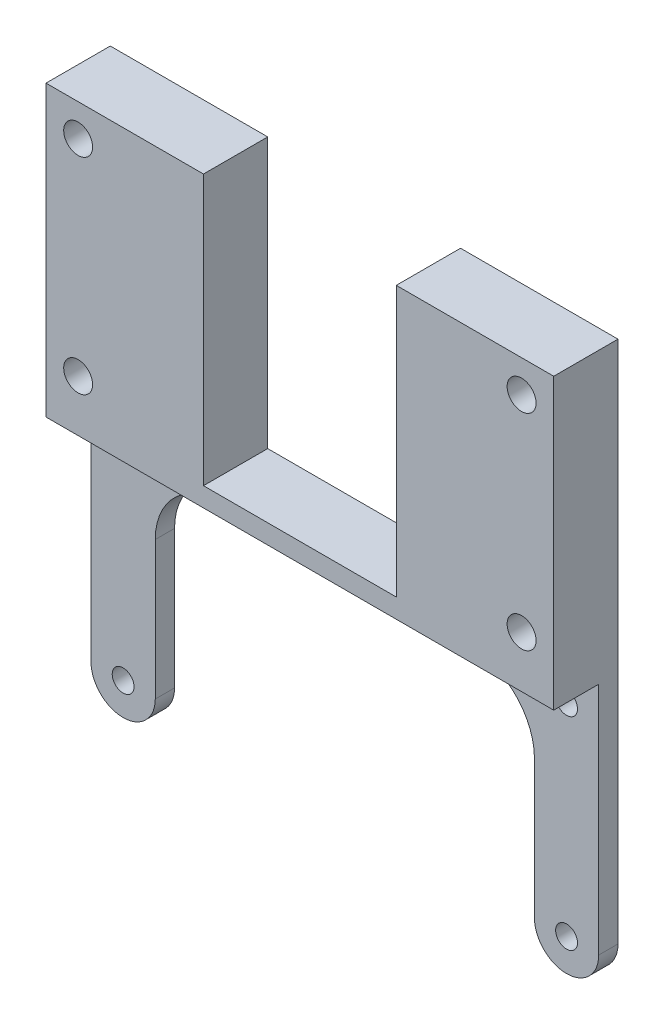
ISO-10303-21;
HEADER;
FILE_DESCRIPTION(('STEP AP214'),'2;1');
FILE_NAME('part.step','',(''),(''),'','','');
FILE_SCHEMA(('AUTOMOTIVE_DESIGN { 1 0 10303 214 1 1 1 1 }'));
ENDSEC;
DATA;
#1=APPLICATION_CONTEXT('core data for automotive mechanical design processes');
#2=APPLICATION_PROTOCOL_DEFINITION('international standard','automotive_design',2000,#1);
#3=PRODUCT_CONTEXT('',#1,'mechanical');
#4=PRODUCT('Part','Part','',(#3));
#5=PRODUCT_RELATED_PRODUCT_CATEGORY('part','',(#4));
#6=PRODUCT_DEFINITION_FORMATION('','',#4);
#7=PRODUCT_DEFINITION_CONTEXT('part definition',#1,'design');
#8=PRODUCT_DEFINITION('design','',#6,#7);
#9=PRODUCT_DEFINITION_SHAPE('','',#8);
#10=(LENGTH_UNIT() NAMED_UNIT(*) SI_UNIT(.MILLI.,.METRE.));
#11=(NAMED_UNIT(*) PLANE_ANGLE_UNIT() SI_UNIT($,.RADIAN.));
#12=(NAMED_UNIT(*) SI_UNIT($,.STERADIAN.) SOLID_ANGLE_UNIT());
#13=UNCERTAINTY_MEASURE_WITH_UNIT(LENGTH_MEASURE(1.E-05),#10,'distance_accuracy_value','');
#14=(GEOMETRIC_REPRESENTATION_CONTEXT(3) GLOBAL_UNCERTAINTY_ASSIGNED_CONTEXT((#13)) GLOBAL_UNIT_ASSIGNED_CONTEXT((#10,
#11,#12)) REPRESENTATION_CONTEXT('',''));
#15=CARTESIAN_POINT('',(0.,0.,0.));
#16=DIRECTION('',(0.,0.,1.));
#17=DIRECTION('',(1.,0.,0.));
#18=AXIS2_PLACEMENT_3D('',#15,#16,#17);
#19=CARTESIAN_POINT('',(-30.9754419857035,0.,3.));
#20=DIRECTION('',(-1.,0.,0.));
#21=DIRECTION('',(0.,0.,1.));
#22=AXIS2_PLACEMENT_3D('',#19,#20,#21);
#23=PLANE('',#22);
#24=DIRECTION('',(0.,1.,0.));
#25=VECTOR('',#24,1.);
#26=CARTESIAN_POINT('',(-30.9754419857035,0.,3.));
#27=LINE('',#26,#25);
#28=CARTESIAN_POINT('',(-30.9754419857035,-23.653190696087,3.));
#29=VERTEX_POINT('',#28);
#30=CARTESIAN_POINT('',(-30.9754419857035,-2.15319069608697,3.));
#31=VERTEX_POINT('',#30);
#32=EDGE_CURVE('E251',#29,#31,#27,.T.);
#33=ORIENTED_EDGE('',*,*,#32,.F.);
#34=DIRECTION('',(0.,0.,-1.));
#35=VECTOR('',#34,1.);
#36=CARTESIAN_POINT('',(-30.9754419857035,-23.653190696087,3.));
#37=LINE('',#36,#35);
#38=CARTESIAN_POINT('',(-30.9754419857035,-23.653190696087,0.));
#39=VERTEX_POINT('',#38);
#40=EDGE_CURVE('E299',#29,#39,#37,.T.);
#41=ORIENTED_EDGE('',*,*,#40,.T.);
#42=DIRECTION('',(0.,1.,0.));
#43=VECTOR('',#42,1.);
#44=CARTESIAN_POINT('',(-30.9754419857035,0.,0.));
#45=LINE('',#44,#43);
#46=CARTESIAN_POINT('',(-30.9754419857035,-2.15319069608697,0.));
#47=VERTEX_POINT('',#46);
#48=EDGE_CURVE('E267',#39,#47,#45,.T.);
#49=ORIENTED_EDGE('',*,*,#48,.T.);
#50=DIRECTION('',(0.,0.,-1.));
#51=VECTOR('',#50,1.);
#52=CARTESIAN_POINT('',(-30.9754419857035,-2.15319069608697,3.));
#53=LINE('',#52,#51);
#54=EDGE_CURVE('E286',#47,#31,#53,.F.);
#55=ORIENTED_EDGE('',*,*,#54,.T.);
#56=EDGE_LOOP('',(#33,#41,#49,#55));
#57=FACE_BOUND('',#56,.T.);
#58=ADVANCED_FACE('F35',(#57),#23,.F.);
#59=CARTESIAN_POINT('',(0.,7.84680930391303,3.));
#60=DIRECTION('',(0.,-1.,0.));
#61=DIRECTION('',(1.,0.,0.));
#62=AXIS2_PLACEMENT_3D('',#59,#60,#61);
#63=PLANE('',#62);
#64=DIRECTION('',(-1.,0.,0.));
#65=VECTOR('',#64,1.);
#66=CARTESIAN_POINT('',(0.,7.84680930391303,0.));
#67=LINE('',#66,#65);
#68=CARTESIAN_POINT('',(18.0245580142965,7.84680930391303,0.));
#69=VERTEX_POINT('',#68);
#70=CARTESIAN_POINT('',(-20.9754419857035,7.84680930391303,0.));
#71=VERTEX_POINT('',#70);
#72=EDGE_CURVE('E269',#69,#71,#67,.T.);
#73=ORIENTED_EDGE('',*,*,#72,.F.);
#74=DIRECTION('',(0.,0.,-1.));
#75=VECTOR('',#74,1.);
#76=CARTESIAN_POINT('',(18.0245580142965,7.84680930391303,3.));
#77=LINE('',#76,#75);
#78=CARTESIAN_POINT('',(18.0245580142965,7.84680930391303,3.));
#79=VERTEX_POINT('',#78);
#80=EDGE_CURVE('E284',#69,#79,#77,.F.);
#81=ORIENTED_EDGE('',*,*,#80,.T.);
#82=DIRECTION('',(-1.,0.,0.));
#83=VECTOR('',#82,1.);
#84=CARTESIAN_POINT('',(0.,7.84680930391303,3.));
#85=LINE('',#84,#83);
#86=CARTESIAN_POINT('',(-20.9754419857035,7.84680930391303,3.));
#87=VERTEX_POINT('',#86);
#88=EDGE_CURVE('E253',#79,#87,#85,.T.);
#89=ORIENTED_EDGE('',*,*,#88,.T.);
#90=DIRECTION('',(0.,0.,-1.));
#91=VECTOR('',#90,1.);
#92=CARTESIAN_POINT('',(-20.9754419857035,7.84680930391303,3.));
#93=LINE('',#92,#91);
#94=EDGE_CURVE('E281',#87,#71,#93,.T.);
#95=ORIENTED_EDGE('',*,*,#94,.T.);
#96=EDGE_LOOP('',(#73,#81,#89,#95));
#97=FACE_BOUND('',#96,.T.);
#98=ADVANCED_FACE('F366',(#97),#63,.T.);
#99=CARTESIAN_POINT('',(28.0245580142965,0.,3.));
#100=DIRECTION('',(-1.,0.,0.));
#101=DIRECTION('',(0.,0.,1.));
#102=AXIS2_PLACEMENT_3D('',#99,#100,#101);
#103=PLANE('',#102);
#104=DIRECTION('',(0.,1.,0.));
#105=VECTOR('',#104,1.);
#106=CARTESIAN_POINT('',(28.0245580142965,0.,0.));
#107=LINE('',#106,#105);
#108=CARTESIAN_POINT('',(28.0245580142965,-23.653190696087,0.));
#109=VERTEX_POINT('',#108);
#110=CARTESIAN_POINT('',(28.0245580142965,-2.15319069608697,0.));
#111=VERTEX_POINT('',#110);
#112=EDGE_CURVE('E273',#109,#111,#107,.T.);
#113=ORIENTED_EDGE('',*,*,#112,.F.);
#114=DIRECTION('',(0.,0.,-1.));
#115=VECTOR('',#114,1.);
#116=CARTESIAN_POINT('',(28.0245580142965,-23.653190696087,3.));
#117=LINE('',#116,#115);
#118=CARTESIAN_POINT('',(28.0245580142965,-23.653190696087,3.));
#119=VERTEX_POINT('',#118);
#120=EDGE_CURVE('E44',#109,#119,#117,.F.);
#121=ORIENTED_EDGE('',*,*,#120,.T.);
#122=DIRECTION('',(0.,1.,0.));
#123=VECTOR('',#122,1.);
#124=CARTESIAN_POINT('',(28.0245580142965,0.,3.));
#125=LINE('',#124,#123);
#126=CARTESIAN_POINT('',(28.0245580142965,-2.15319069608697,3.));
#127=VERTEX_POINT('',#126);
#128=EDGE_CURVE('E257',#119,#127,#125,.T.);
#129=ORIENTED_EDGE('',*,*,#128,.T.);
#130=DIRECTION('',(0.,0.,-1.));
#131=VECTOR('',#130,1.);
#132=CARTESIAN_POINT('',(28.0245580142965,-2.15319069608697,0.));
#133=LINE('',#132,#131);
#134=EDGE_CURVE('E266',#127,#111,#133,.T.);
#135=ORIENTED_EDGE('',*,*,#134,.T.);
#136=EDGE_LOOP('',(#113,#121,#129,#135));
#137=FACE_BOUND('',#136,.T.);
#138=ADVANCED_FACE('F375',(#137),#103,.T.);
#139=CARTESIAN_POINT('',(38.0245580142965,0.,3.));
#140=DIRECTION('',(1.,0.,0.));
#141=DIRECTION('',(0.,0.,-1.));
#142=AXIS2_PLACEMENT_3D('',#139,#140,#141);
#143=PLANE('',#142);
#144=DIRECTION('',(0.,-1.,0.));
#145=VECTOR('',#144,1.);
#146=CARTESIAN_POINT('',(38.0245580142965,0.,3.));
#147=LINE('',#146,#145);
#148=CARTESIAN_POINT('',(38.0245580142965,12.846809303913,3.));
#149=VERTEX_POINT('',#148);
#150=CARTESIAN_POINT('',(38.0245580142965,-23.653190696087,3.));
#151=VERTEX_POINT('',#150);
#152=EDGE_CURVE('E259',#149,#151,#147,.T.);
#153=ORIENTED_EDGE('',*,*,#152,.T.);
#154=DIRECTION('',(0.,0.,-1.));
#155=VECTOR('',#154,1.);
#156=CARTESIAN_POINT('',(38.0245580142965,-23.653190696087,0.));
#157=LINE('',#156,#155);
#158=CARTESIAN_POINT('',(38.0245580142965,-23.653190696087,0.));
#159=VERTEX_POINT('',#158);
#160=EDGE_CURVE('E11',#151,#159,#157,.T.);
#161=ORIENTED_EDGE('',*,*,#160,.T.);
#162=DIRECTION('',(0.,-1.,0.));
#163=VECTOR('',#162,1.);
#164=CARTESIAN_POINT('',(38.0245580142965,0.,0.));
#165=LINE('',#164,#163);
#166=CARTESIAN_POINT('',(38.0245580142965,57.846809303913,0.));
#167=VERTEX_POINT('',#166);
#168=EDGE_CURVE('E275',#167,#159,#165,.T.);
#169=ORIENTED_EDGE('',*,*,#168,.F.);
#170=DIRECTION('',(0.,0.,-1.));
#171=VECTOR('',#170,1.);
#172=CARTESIAN_POINT('',(38.0245580142965,57.846809303913,10.));
#173=LINE('',#172,#171);
#174=CARTESIAN_POINT('',(38.0245580142965,57.846809303913,10.));
#175=VERTEX_POINT('',#174);
#176=EDGE_CURVE('E224',#175,#167,#173,.T.);
#177=ORIENTED_EDGE('',*,*,#176,.F.);
#178=DIRECTION('',(0.,1.,0.));
#179=VECTOR('',#178,1.);
#180=CARTESIAN_POINT('',(38.0245580142965,0.,10.));
#181=LINE('',#180,#179);
#182=CARTESIAN_POINT('',(38.0245580142965,12.846809303913,10.));
#183=VERTEX_POINT('',#182);
#184=EDGE_CURVE('E195',#183,#175,#181,.T.);
#185=ORIENTED_EDGE('',*,*,#184,.F.);
#186=DIRECTION('',(0.,0.,-1.));
#187=VECTOR('',#186,1.);
#188=CARTESIAN_POINT('',(38.0245580142965,12.846809303913,10.));
#189=LINE('',#188,#187);
#190=EDGE_CURVE('E221',#183,#149,#189,.T.);
#191=ORIENTED_EDGE('',*,*,#190,.T.);
#192=EDGE_LOOP('',(#153,#161,#169,#177,#185,#191));
#193=FACE_BOUND('',#192,.T.);
#194=ADVANCED_FACE('F333',(#193),#143,.T.);
#195=CARTESIAN_POINT('',(-40.9754419857035,0.,3.));
#196=DIRECTION('',(1.,0.,0.));
#197=DIRECTION('',(0.,1.,0.));
#198=AXIS2_PLACEMENT_3D('',#195,#196,#197);
#199=PLANE('',#198);
#200=DIRECTION('',(0.,-1.,0.));
#201=VECTOR('',#200,1.);
#202=CARTESIAN_POINT('',(-40.9754419857035,0.,0.));
#203=LINE('',#202,#201);
#204=CARTESIAN_POINT('',(-40.9754419857035,57.846809303913,0.));
#205=VERTEX_POINT('',#204);
#206=CARTESIAN_POINT('',(-40.9754419857035,-23.653190696087,0.));
#207=VERTEX_POINT('',#206);
#208=EDGE_CURVE('E254',#205,#207,#203,.T.);
#209=ORIENTED_EDGE('',*,*,#208,.T.);
#210=DIRECTION('',(0.,0.,-1.));
#211=VECTOR('',#210,1.);
#212=CARTESIAN_POINT('',(-40.9754419857035,-23.653190696087,3.));
#213=LINE('',#212,#211);
#214=CARTESIAN_POINT('',(-40.9754419857035,-23.653190696087,3.));
#215=VERTEX_POINT('',#214);
#216=EDGE_CURVE('E52',#207,#215,#213,.F.);
#217=ORIENTED_EDGE('',*,*,#216,.T.);
#218=DIRECTION('',(0.,-1.,0.));
#219=VECTOR('',#218,1.);
#220=CARTESIAN_POINT('',(-40.9754419857035,0.,3.));
#221=LINE('',#220,#219);
#222=CARTESIAN_POINT('',(-40.9754419857035,12.846809303913,3.));
#223=VERTEX_POINT('',#222);
#224=EDGE_CURVE('E264',#223,#215,#221,.T.);
#225=ORIENTED_EDGE('',*,*,#224,.F.);
#226=DIRECTION('',(0.,0.,-1.));
#227=VECTOR('',#226,1.);
#228=CARTESIAN_POINT('',(-40.9754419857035,12.846809303913,10.));
#229=LINE('',#228,#227);
#230=CARTESIAN_POINT('',(-40.9754419857035,12.846809303913,10.));
#231=VERTEX_POINT('',#230);
#232=EDGE_CURVE('E218',#231,#223,#229,.T.);
#233=ORIENTED_EDGE('',*,*,#232,.F.);
#234=DIRECTION('',(0.,1.,0.));
#235=VECTOR('',#234,1.);
#236=CARTESIAN_POINT('',(-40.9754419857035,0.,10.));
#237=LINE('',#236,#235);
#238=CARTESIAN_POINT('',(-40.9754419857035,57.846809303913,10.));
#239=VERTEX_POINT('',#238);
#240=EDGE_CURVE('E200',#231,#239,#237,.T.);
#241=ORIENTED_EDGE('',*,*,#240,.T.);
#242=DIRECTION('',(0.,0.,-1.));
#243=VECTOR('',#242,1.);
#244=CARTESIAN_POINT('',(-40.9754419857035,57.846809303913,10.));
#245=LINE('',#244,#243);
#246=EDGE_CURVE('E215',#239,#205,#245,.T.);
#247=ORIENTED_EDGE('',*,*,#246,.T.);
#248=EDGE_LOOP('',(#209,#217,#225,#233,#241,#247));
#249=FACE_BOUND('',#248,.T.);
#250=ADVANCED_FACE('F377',(#249),#199,.F.);
#251=CARTESIAN_POINT('',(0.,0.,3.));
#252=DIRECTION('',(0.,0.,1.));
#253=DIRECTION('',(1.,0.,0.));
#254=AXIS2_PLACEMENT_3D('',#251,#252,#253);
#255=PLANE('',#254);
#256=CARTESIAN_POINT('',(33.0245580142965,7.84680930391304,3.));
#257=DIRECTION('',(0.,0.,-1.));
#258=DIRECTION('',(-1.,0.,0.));
#259=AXIS2_PLACEMENT_3D('',#256,#257,#258);
#260=CIRCLE('',#259,1.7);
#261=CARTESIAN_POINT('',(31.3245580142965,7.84680930391304,3.));
#262=VERTEX_POINT('',#261);
#263=EDGE_CURVE('E230',#262,#262,#260,.T.);
#264=ORIENTED_EDGE('',*,*,#263,.T.);
#265=EDGE_LOOP('',(#264));
#266=FACE_BOUND('',#265,.T.);
#267=CARTESIAN_POINT('',(-35.9754419857035,-23.653190696087,3.));
#268=DIRECTION('',(0.,0.,-1.));
#269=DIRECTION('',(-1.,0.,0.));
#270=AXIS2_PLACEMENT_3D('',#267,#268,#269);
#271=CIRCLE('',#270,1.7);
#272=CARTESIAN_POINT('',(-37.6754419857035,-23.653190696087,3.));
#273=VERTEX_POINT('',#272);
#274=EDGE_CURVE('E236',#273,#273,#271,.T.);
#275=ORIENTED_EDGE('',*,*,#274,.T.);
#276=EDGE_LOOP('',(#275));
#277=FACE_BOUND('',#276,.T.);
#278=CARTESIAN_POINT('',(-35.9754419857035,7.84680930391303,3.));
#279=DIRECTION('',(0.,0.,-1.));
#280=DIRECTION('',(-1.,0.,0.));
#281=AXIS2_PLACEMENT_3D('',#278,#279,#280);
#282=CIRCLE('',#281,1.7);
#283=CARTESIAN_POINT('',(-37.6754419857035,7.84680930391303,3.));
#284=VERTEX_POINT('',#283);
#285=EDGE_CURVE('E242',#284,#284,#282,.T.);
#286=ORIENTED_EDGE('',*,*,#285,.T.);
#287=EDGE_LOOP('',(#286));
#288=FACE_BOUND('',#287,.T.);
#289=CARTESIAN_POINT('',(33.0245580142965,-23.653190696087,3.));
#290=DIRECTION('',(0.,0.,-1.));
#291=DIRECTION('',(-1.,0.,0.));
#292=AXIS2_PLACEMENT_3D('',#289,#290,#291);
#293=CIRCLE('',#292,1.7);
#294=CARTESIAN_POINT('',(31.3245580142965,-23.653190696087,3.));
#295=VERTEX_POINT('',#294);
#296=EDGE_CURVE('E248',#295,#295,#293,.T.);
#297=ORIENTED_EDGE('',*,*,#296,.T.);
#298=EDGE_LOOP('',(#297));
#299=FACE_BOUND('',#298,.T.);
#300=CARTESIAN_POINT('',(-35.9754419857035,-23.653190696087,3.));
#301=DIRECTION('',(0.,0.,1.));
#302=DIRECTION('',(1.,0.,0.));
#303=AXIS2_PLACEMENT_3D('',#300,#301,#302);
#304=CIRCLE('',#303,5.);
#305=CARTESIAN_POINT('',(-35.9754419857035,-28.653190696087,3.));
#306=VERTEX_POINT('',#305);
#307=EDGE_CURVE('E313',#215,#306,#304,.T.);
#308=ORIENTED_EDGE('',*,*,#307,.T.);
#309=CARTESIAN_POINT('',(-35.9754419857035,-23.653190696087,3.));
#310=DIRECTION('',(0.,0.,1.));
#311=DIRECTION('',(1.,0.,0.));
#312=AXIS2_PLACEMENT_3D('',#309,#310,#311);
#313=CIRCLE('',#312,5.);
#314=EDGE_CURVE('E315',#306,#29,#313,.T.);
#315=ORIENTED_EDGE('',*,*,#314,.T.);
#316=ORIENTED_EDGE('',*,*,#32,.T.);
#317=CARTESIAN_POINT('',(-20.9754419857035,-2.15319069608697,3.));
#318=DIRECTION('',(0.,0.,1.));
#319=DIRECTION('',(1.,0.,0.));
#320=AXIS2_PLACEMENT_3D('',#317,#318,#319);
#321=CIRCLE('',#320,10.);
#322=EDGE_CURVE('E297',#31,#87,#321,.F.);
#323=ORIENTED_EDGE('',*,*,#322,.T.);
#324=ORIENTED_EDGE('',*,*,#88,.F.);
#325=CARTESIAN_POINT('',(18.0245580142965,-2.15319069608697,3.));
#326=DIRECTION('',(0.,0.,1.));
#327=DIRECTION('',(1.,0.,0.));
#328=AXIS2_PLACEMENT_3D('',#325,#326,#327);
#329=CIRCLE('',#328,10.);
#330=EDGE_CURVE('E291',#79,#127,#329,.F.);
#331=ORIENTED_EDGE('',*,*,#330,.T.);
#332=ORIENTED_EDGE('',*,*,#128,.F.);
#333=CARTESIAN_POINT('',(33.0245580142965,-23.653190696087,3.));
#334=DIRECTION('',(0.,0.,1.));
#335=DIRECTION('',(1.,0.,0.));
#336=AXIS2_PLACEMENT_3D('',#333,#334,#335);
#337=CIRCLE('',#336,5.);
#338=CARTESIAN_POINT('',(33.0245580142965,-28.653190696087,3.));
#339=VERTEX_POINT('',#338);
#340=EDGE_CURVE('E311',#119,#339,#337,.T.);
#341=ORIENTED_EDGE('',*,*,#340,.T.);
#342=CARTESIAN_POINT('',(33.0245580142965,-23.653190696087,3.));
#343=DIRECTION('',(0.,0.,1.));
#344=DIRECTION('',(1.,0.,0.));
#345=AXIS2_PLACEMENT_3D('',#342,#343,#344);
#346=CIRCLE('',#345,5.);
#347=EDGE_CURVE('E60',#339,#151,#346,.T.);
#348=ORIENTED_EDGE('',*,*,#347,.T.);
#349=ORIENTED_EDGE('',*,*,#152,.F.);
#350=DIRECTION('',(1.,0.,0.));
#351=VECTOR('',#350,1.);
#352=CARTESIAN_POINT('',(0.,12.846809303913,3.));
#353=LINE('',#352,#351);
#354=EDGE_CURVE('E261',#223,#149,#353,.T.);
#355=ORIENTED_EDGE('',*,*,#354,.F.);
#356=ORIENTED_EDGE('',*,*,#224,.T.);
#357=EDGE_LOOP('',(#308,#315,#316,#323,#324,#331,#332,#341,#348,#349,#355,#356));
#358=FACE_BOUND('',#357,.T.);
#359=ADVANCED_FACE('F348',(#266,#277,#288,#299,#358),#255,.T.);
#360=CARTESIAN_POINT('',(0.,0.,0.));
#361=DIRECTION('',(0.,0.,1.));
#362=DIRECTION('',(1.,0.,0.));
#363=AXIS2_PLACEMENT_3D('',#360,#361,#362);
#364=PLANE('',#363);
#365=CARTESIAN_POINT('',(33.0245580142965,52.846809303913,0.));
#366=DIRECTION('',(0.,0.,-1.));
#367=DIRECTION('',(-1.,0.,0.));
#368=AXIS2_PLACEMENT_3D('',#365,#366,#367);
#369=CIRCLE('',#368,2.25);
#370=CARTESIAN_POINT('',(30.7745580142965,52.846809303913,0.));
#371=VERTEX_POINT('',#370);
#372=EDGE_CURVE('E638',#371,#371,#369,.T.);
#373=ORIENTED_EDGE('',*,*,#372,.F.);
#374=EDGE_LOOP('',(#373));
#375=FACE_BOUND('',#374,.T.);
#376=CARTESIAN_POINT('',(33.0245580142965,20.846809303913,0.));
#377=DIRECTION('',(0.,0.,-1.));
#378=DIRECTION('',(-1.,0.,0.));
#379=AXIS2_PLACEMENT_3D('',#376,#377,#378);
#380=CIRCLE('',#379,2.25);
#381=CARTESIAN_POINT('',(30.7745580142965,20.846809303913,0.));
#382=VERTEX_POINT('',#381);
#383=EDGE_CURVE('E640',#382,#382,#380,.T.);
#384=ORIENTED_EDGE('',*,*,#383,.F.);
#385=EDGE_LOOP('',(#384));
#386=FACE_BOUND('',#385,.T.);
#387=CARTESIAN_POINT('',(-35.9754419857035,20.846809303913,0.));
#388=DIRECTION('',(0.,0.,-1.));
#389=DIRECTION('',(-1.,0.,0.));
#390=AXIS2_PLACEMENT_3D('',#387,#388,#389);
#391=CIRCLE('',#390,2.25);
#392=CARTESIAN_POINT('',(-38.2254419857035,20.846809303913,0.));
#393=VERTEX_POINT('',#392);
#394=EDGE_CURVE('E648',#393,#393,#391,.T.);
#395=ORIENTED_EDGE('',*,*,#394,.F.);
#396=EDGE_LOOP('',(#395));
#397=FACE_BOUND('',#396,.T.);
#398=CARTESIAN_POINT('',(-35.9754419857035,52.846809303913,0.));
#399=DIRECTION('',(0.,0.,-1.));
#400=DIRECTION('',(-1.,0.,0.));
#401=AXIS2_PLACEMENT_3D('',#398,#399,#400);
#402=CIRCLE('',#401,2.25);
#403=CARTESIAN_POINT('',(-38.2254419857035,52.846809303913,0.));
#404=VERTEX_POINT('',#403);
#405=EDGE_CURVE('E653',#404,#404,#402,.T.);
#406=ORIENTED_EDGE('',*,*,#405,.F.);
#407=EDGE_LOOP('',(#406));
#408=FACE_BOUND('',#407,.T.);
#409=CARTESIAN_POINT('',(33.0245580142965,7.84680930391304,0.));
#410=DIRECTION('',(0.,0.,-1.));
#411=DIRECTION('',(-1.,0.,0.));
#412=AXIS2_PLACEMENT_3D('',#409,#410,#411);
#413=CIRCLE('',#412,1.69999999999999);
#414=CARTESIAN_POINT('',(31.3245580142965,7.84680930391304,0.));
#415=VERTEX_POINT('',#414);
#416=EDGE_CURVE('E211',#415,#415,#413,.T.);
#417=ORIENTED_EDGE('',*,*,#416,.F.);
#418=EDGE_LOOP('',(#417));
#419=FACE_BOUND('',#418,.T.);
#420=CARTESIAN_POINT('',(-35.9754419857035,-23.653190696087,0.));
#421=DIRECTION('',(0.,0.,-1.));
#422=DIRECTION('',(-1.,0.,0.));
#423=AXIS2_PLACEMENT_3D('',#420,#421,#422);
#424=CIRCLE('',#423,1.69999999999999);
#425=CARTESIAN_POINT('',(-37.6754419857035,-23.653190696087,0.));
#426=VERTEX_POINT('',#425);
#427=EDGE_CURVE('E233',#426,#426,#424,.T.);
#428=ORIENTED_EDGE('',*,*,#427,.F.);
#429=EDGE_LOOP('',(#428));
#430=FACE_BOUND('',#429,.T.);
#431=CARTESIAN_POINT('',(-35.9754419857035,7.84680930391303,0.));
#432=DIRECTION('',(0.,0.,-1.));
#433=DIRECTION('',(-1.,0.,0.));
#434=AXIS2_PLACEMENT_3D('',#431,#432,#433);
#435=CIRCLE('',#434,1.69999999999999);
#436=CARTESIAN_POINT('',(-37.6754419857035,7.84680930391303,0.));
#437=VERTEX_POINT('',#436);
#438=EDGE_CURVE('E239',#437,#437,#435,.T.);
#439=ORIENTED_EDGE('',*,*,#438,.F.);
#440=EDGE_LOOP('',(#439));
#441=FACE_BOUND('',#440,.T.);
#442=CARTESIAN_POINT('',(33.0245580142965,-23.653190696087,0.));
#443=DIRECTION('',(0.,0.,-1.));
#444=DIRECTION('',(-1.,0.,0.));
#445=AXIS2_PLACEMENT_3D('',#442,#443,#444);
#446=CIRCLE('',#445,1.69999999999999);
#447=CARTESIAN_POINT('',(31.3245580142965,-23.653190696087,0.));
#448=VERTEX_POINT('',#447);
#449=EDGE_CURVE('E245',#448,#448,#446,.T.);
#450=ORIENTED_EDGE('',*,*,#449,.F.);
#451=EDGE_LOOP('',(#450));
#452=FACE_BOUND('',#451,.T.);
#453=ORIENTED_EDGE('',*,*,#48,.F.);
#454=CARTESIAN_POINT('',(-35.9754419857035,-23.653190696087,0.));
#455=DIRECTION('',(0.,0.,1.));
#456=DIRECTION('',(1.,0.,0.));
#457=AXIS2_PLACEMENT_3D('',#454,#455,#456);
#458=CIRCLE('',#457,5.);
#459=CARTESIAN_POINT('',(-35.9754419857035,-28.653190696087,0.));
#460=VERTEX_POINT('',#459);
#461=EDGE_CURVE('E308',#39,#460,#458,.F.);
#462=ORIENTED_EDGE('',*,*,#461,.T.);
#463=CARTESIAN_POINT('',(-35.9754419857035,-23.653190696087,0.));
#464=DIRECTION('',(0.,0.,1.));
#465=DIRECTION('',(1.,0.,0.));
#466=AXIS2_PLACEMENT_3D('',#463,#464,#465);
#467=CIRCLE('',#466,5.);
#468=EDGE_CURVE('E306',#460,#207,#467,.F.);
#469=ORIENTED_EDGE('',*,*,#468,.T.);
#470=ORIENTED_EDGE('',*,*,#208,.F.);
#471=DIRECTION('',(-1.,0.,0.));
#472=VECTOR('',#471,1.);
#473=CARTESIAN_POINT('',(0.,57.846809303913,0.));
#474=LINE('',#473,#472);
#475=CARTESIAN_POINT('',(-16.4754419857035,57.846809303913,0.));
#476=VERTEX_POINT('',#475);
#477=EDGE_CURVE('E188',#476,#205,#474,.T.);
#478=ORIENTED_EDGE('',*,*,#477,.F.);
#479=DIRECTION('',(0.,1.,0.));
#480=VECTOR('',#479,1.);
#481=CARTESIAN_POINT('',(-16.4754419857035,0.,0.));
#482=LINE('',#481,#480);
#483=CARTESIAN_POINT('',(-16.4754419857035,15.846809303913,0.));
#484=VERTEX_POINT('',#483);
#485=EDGE_CURVE('E186',#484,#476,#482,.T.);
#486=ORIENTED_EDGE('',*,*,#485,.F.);
#487=DIRECTION('',(1.,0.,0.));
#488=VECTOR('',#487,1.);
#489=CARTESIAN_POINT('',(0.,15.846809303913,0.));
#490=LINE('',#489,#488);
#491=CARTESIAN_POINT('',(13.5245580142965,15.846809303913,0.));
#492=VERTEX_POINT('',#491);
#493=EDGE_CURVE('E204',#484,#492,#490,.T.);
#494=ORIENTED_EDGE('',*,*,#493,.T.);
#495=DIRECTION('',(0.,1.,0.));
#496=VECTOR('',#495,1.);
#497=CARTESIAN_POINT('',(13.5245580142965,0.,0.));
#498=LINE('',#497,#496);
#499=CARTESIAN_POINT('',(13.5245580142965,57.846809303913,0.));
#500=VERTEX_POINT('',#499);
#501=EDGE_CURVE('E167',#492,#500,#498,.T.);
#502=ORIENTED_EDGE('',*,*,#501,.T.);
#503=EDGE_CURVE('E207',#167,#500,#474,.T.);
#504=ORIENTED_EDGE('',*,*,#503,.F.);
#505=ORIENTED_EDGE('',*,*,#168,.T.);
#506=CARTESIAN_POINT('',(33.0245580142965,-23.653190696087,0.));
#507=DIRECTION('',(0.,0.,1.));
#508=DIRECTION('',(1.,0.,0.));
#509=AXIS2_PLACEMENT_3D('',#506,#507,#508);
#510=CIRCLE('',#509,5.);
#511=CARTESIAN_POINT('',(33.0245580142965,-28.653190696087,0.));
#512=VERTEX_POINT('',#511);
#513=EDGE_CURVE('E302',#159,#512,#510,.F.);
#514=ORIENTED_EDGE('',*,*,#513,.T.);
#515=CARTESIAN_POINT('',(33.0245580142965,-23.653190696087,0.));
#516=DIRECTION('',(0.,0.,1.));
#517=DIRECTION('',(1.,0.,0.));
#518=AXIS2_PLACEMENT_3D('',#515,#516,#517);
#519=CIRCLE('',#518,5.);
#520=EDGE_CURVE('E304',#512,#109,#519,.F.);
#521=ORIENTED_EDGE('',*,*,#520,.T.);
#522=ORIENTED_EDGE('',*,*,#112,.T.);
#523=CARTESIAN_POINT('',(18.0245580142965,-2.15319069608697,0.));
#524=DIRECTION('',(0.,0.,1.));
#525=DIRECTION('',(1.,0.,0.));
#526=AXIS2_PLACEMENT_3D('',#523,#524,#525);
#527=CIRCLE('',#526,10.);
#528=EDGE_CURVE('E289',#111,#69,#527,.T.);
#529=ORIENTED_EDGE('',*,*,#528,.T.);
#530=ORIENTED_EDGE('',*,*,#72,.T.);
#531=CARTESIAN_POINT('',(-20.9754419857035,-2.15319069608697,0.));
#532=DIRECTION('',(0.,0.,1.));
#533=DIRECTION('',(1.,0.,0.));
#534=AXIS2_PLACEMENT_3D('',#531,#532,#533);
#535=CIRCLE('',#534,10.);
#536=EDGE_CURVE('E294',#71,#47,#535,.T.);
#537=ORIENTED_EDGE('',*,*,#536,.T.);
#538=EDGE_LOOP('',(#453,#462,#469,#470,#478,#486,#494,#502,#504,#505,#514,#521,#522,#529,#530,#537));
#539=FACE_BOUND('',#538,.T.);
#540=ADVANCED_FACE('F338',(#375,#386,#397,#408,#419,#430,#441,#452,#539),#364,.F.);
#541=CARTESIAN_POINT('',(18.0245580142965,-2.15319069608697,3.));
#542=DIRECTION('',(0.,0.,1.));
#543=DIRECTION('',(1.,0.,0.));
#544=AXIS2_PLACEMENT_3D('',#541,#542,#543);
#545=CYLINDRICAL_SURFACE('',#544,10.);
#546=ORIENTED_EDGE('',*,*,#330,.F.);
#547=ORIENTED_EDGE('',*,*,#80,.F.);
#548=ORIENTED_EDGE('',*,*,#528,.F.);
#549=ORIENTED_EDGE('',*,*,#134,.F.);
#550=EDGE_LOOP('',(#546,#547,#548,#549));
#551=FACE_BOUND('',#550,.T.);
#552=ADVANCED_FACE('F370',(#551),#545,.F.);
#553=CARTESIAN_POINT('',(-20.9754419857035,-2.15319069608697,3.));
#554=DIRECTION('',(0.,0.,-1.));
#555=DIRECTION('',(-1.,0.,0.));
#556=AXIS2_PLACEMENT_3D('',#553,#554,#555);
#557=CYLINDRICAL_SURFACE('',#556,10.);
#558=ORIENTED_EDGE('',*,*,#322,.F.);
#559=ORIENTED_EDGE('',*,*,#54,.F.);
#560=ORIENTED_EDGE('',*,*,#536,.F.);
#561=ORIENTED_EDGE('',*,*,#94,.F.);
#562=EDGE_LOOP('',(#558,#559,#560,#561));
#563=FACE_BOUND('',#562,.T.);
#564=ADVANCED_FACE('F361',(#563),#557,.F.);
#565=CARTESIAN_POINT('',(-35.9754419857035,-23.653190696087,3.));
#566=DIRECTION('',(0.,0.,-1.));
#567=DIRECTION('',(-1.,0.,0.));
#568=AXIS2_PLACEMENT_3D('',#565,#566,#567);
#569=CYLINDRICAL_SURFACE('',#568,5.);
#570=DIRECTION('',(0.,0.,-1.));
#571=VECTOR('',#570,1.);
#572=CARTESIAN_POINT('',(-35.9754419857035,-28.653190696087,3.));
#573=LINE('',#572,#571);
#574=EDGE_CURVE('E270',#306,#460,#573,.T.);
#575=ORIENTED_EDGE('',*,*,#574,.F.);
#576=ORIENTED_EDGE('',*,*,#307,.F.);
#577=ORIENTED_EDGE('',*,*,#216,.F.);
#578=ORIENTED_EDGE('',*,*,#468,.F.);
#579=EDGE_LOOP('',(#575,#576,#577,#578));
#580=FACE_BOUND('',#579,.T.);
#581=ADVANCED_FACE('F351',(#580),#569,.T.);
#582=CARTESIAN_POINT('',(-35.9754419857035,-23.653190696087,3.));
#583=DIRECTION('',(0.,0.,-1.));
#584=DIRECTION('',(-1.,0.,0.));
#585=AXIS2_PLACEMENT_3D('',#582,#583,#584);
#586=CYLINDRICAL_SURFACE('',#585,5.);
#587=ORIENTED_EDGE('',*,*,#314,.F.);
#588=ORIENTED_EDGE('',*,*,#574,.T.);
#589=ORIENTED_EDGE('',*,*,#461,.F.);
#590=ORIENTED_EDGE('',*,*,#40,.F.);
#591=EDGE_LOOP('',(#587,#588,#589,#590));
#592=FACE_BOUND('',#591,.T.);
#593=ADVANCED_FACE('F354',(#592),#586,.T.);
#594=CARTESIAN_POINT('',(33.0245580142965,-23.653190696087,3.));
#595=DIRECTION('',(0.,0.,1.));
#596=DIRECTION('',(1.,0.,0.));
#597=AXIS2_PLACEMENT_3D('',#594,#595,#596);
#598=CYLINDRICAL_SURFACE('',#597,5.);
#599=ORIENTED_EDGE('',*,*,#160,.F.);
#600=ORIENTED_EDGE('',*,*,#347,.F.);
#601=DIRECTION('',(0.,0.,-1.));
#602=VECTOR('',#601,1.);
#603=CARTESIAN_POINT('',(33.0245580142965,-28.653190696087,3.));
#604=LINE('',#603,#602);
#605=EDGE_CURVE('E39',#512,#339,#604,.F.);
#606=ORIENTED_EDGE('',*,*,#605,.F.);
#607=ORIENTED_EDGE('',*,*,#513,.F.);
#608=EDGE_LOOP('',(#599,#600,#606,#607));
#609=FACE_BOUND('',#608,.T.);
#610=ADVANCED_FACE('F37',(#609),#598,.T.);
#611=CARTESIAN_POINT('',(33.0245580142965,-23.653190696087,3.));
#612=DIRECTION('',(0.,0.,1.));
#613=DIRECTION('',(1.,0.,0.));
#614=AXIS2_PLACEMENT_3D('',#611,#612,#613);
#615=CYLINDRICAL_SURFACE('',#614,5.);
#616=ORIENTED_EDGE('',*,*,#340,.F.);
#617=ORIENTED_EDGE('',*,*,#120,.F.);
#618=ORIENTED_EDGE('',*,*,#520,.F.);
#619=ORIENTED_EDGE('',*,*,#605,.T.);
#620=EDGE_LOOP('',(#616,#617,#618,#619));
#621=FACE_BOUND('',#620,.T.);
#622=ADVANCED_FACE('F327',(#621),#615,.T.);
#623=CARTESIAN_POINT('',(33.0245580142965,-23.653190696087,0.));
#624=DIRECTION('',(0.,0.,-1.));
#625=DIRECTION('',(-1.,0.,0.));
#626=AXIS2_PLACEMENT_3D('',#623,#624,#625);
#627=CYLINDRICAL_SURFACE('',#626,1.69999999999999);
#628=ORIENTED_EDGE('',*,*,#296,.F.);
#629=EDGE_LOOP('',(#628));
#630=FACE_BOUND('',#629,.T.);
#631=ORIENTED_EDGE('',*,*,#449,.T.);
#632=EDGE_LOOP('',(#631));
#633=FACE_BOUND('',#632,.T.);
#634=ADVANCED_FACE('F412',(#630,#633),#627,.F.);
#635=CARTESIAN_POINT('',(-35.9754419857035,7.84680930391303,0.));
#636=DIRECTION('',(0.,0.,-1.));
#637=DIRECTION('',(-1.,0.,0.));
#638=AXIS2_PLACEMENT_3D('',#635,#636,#637);
#639=CYLINDRICAL_SURFACE('',#638,1.69999999999999);
#640=ORIENTED_EDGE('',*,*,#285,.F.);
#641=EDGE_LOOP('',(#640));
#642=FACE_BOUND('',#641,.T.);
#643=ORIENTED_EDGE('',*,*,#438,.T.);
#644=EDGE_LOOP('',(#643));
#645=FACE_BOUND('',#644,.T.);
#646=ADVANCED_FACE('F417',(#642,#645),#639,.F.);
#647=CARTESIAN_POINT('',(-35.9754419857035,-23.653190696087,0.));
#648=DIRECTION('',(0.,0.,-1.));
#649=DIRECTION('',(-1.,0.,0.));
#650=AXIS2_PLACEMENT_3D('',#647,#648,#649);
#651=CYLINDRICAL_SURFACE('',#650,1.69999999999999);
#652=ORIENTED_EDGE('',*,*,#274,.F.);
#653=EDGE_LOOP('',(#652));
#654=FACE_BOUND('',#653,.T.);
#655=ORIENTED_EDGE('',*,*,#427,.T.);
#656=EDGE_LOOP('',(#655));
#657=FACE_BOUND('',#656,.T.);
#658=ADVANCED_FACE('F530',(#654,#657),#651,.F.);
#659=CARTESIAN_POINT('',(33.0245580142965,7.84680930391304,0.));
#660=DIRECTION('',(0.,0.,-1.));
#661=DIRECTION('',(-1.,0.,0.));
#662=AXIS2_PLACEMENT_3D('',#659,#660,#661);
#663=CYLINDRICAL_SURFACE('',#662,1.69999999999999);
#664=ORIENTED_EDGE('',*,*,#263,.F.);
#665=EDGE_LOOP('',(#664));
#666=FACE_BOUND('',#665,.T.);
#667=ORIENTED_EDGE('',*,*,#416,.T.);
#668=EDGE_LOOP('',(#667));
#669=FACE_BOUND('',#668,.T.);
#670=ADVANCED_FACE('F538',(#666,#669),#663,.F.);
#671=CARTESIAN_POINT('',(0.,12.846809303913,10.));
#672=DIRECTION('',(0.,1.,0.));
#673=DIRECTION('',(-1.,0.,0.));
#674=AXIS2_PLACEMENT_3D('',#671,#672,#673);
#675=PLANE('',#674);
#676=ORIENTED_EDGE('',*,*,#232,.T.);
#677=ORIENTED_EDGE('',*,*,#354,.T.);
#678=ORIENTED_EDGE('',*,*,#190,.F.);
#679=DIRECTION('',(1.,0.,0.));
#680=VECTOR('',#679,1.);
#681=CARTESIAN_POINT('',(0.,12.846809303913,10.));
#682=LINE('',#681,#680);
#683=EDGE_CURVE('E198',#231,#183,#682,.T.);
#684=ORIENTED_EDGE('',*,*,#683,.F.);
#685=EDGE_LOOP('',(#676,#677,#678,#684));
#686=FACE_BOUND('',#685,.T.);
#687=ADVANCED_FACE('F346',(#686),#675,.F.);
#688=CARTESIAN_POINT('',(0.,15.846809303913,10.));
#689=DIRECTION('',(0.,1.,0.));
#690=DIRECTION('',(-1.,0.,0.));
#691=AXIS2_PLACEMENT_3D('',#688,#689,#690);
#692=PLANE('',#691);
#693=ORIENTED_EDGE('',*,*,#493,.F.);
#694=DIRECTION('',(0.,0.,-1.));
#695=VECTOR('',#694,1.);
#696=CARTESIAN_POINT('',(-16.4754419857035,15.846809303913,10.));
#697=LINE('',#696,#695);
#698=CARTESIAN_POINT('',(-16.4754419857035,15.846809303913,10.));
#699=VERTEX_POINT('',#698);
#700=EDGE_CURVE('E184',#699,#484,#697,.T.);
#701=ORIENTED_EDGE('',*,*,#700,.F.);
#702=DIRECTION('',(1.,0.,0.));
#703=VECTOR('',#702,1.);
#704=CARTESIAN_POINT('',(0.,15.846809303913,10.));
#705=LINE('',#704,#703);
#706=CARTESIAN_POINT('',(13.5245580142965,15.846809303913,10.));
#707=VERTEX_POINT('',#706);
#708=EDGE_CURVE('E178',#699,#707,#705,.T.);
#709=ORIENTED_EDGE('',*,*,#708,.T.);
#710=DIRECTION('',(0.,0.,-1.));
#711=VECTOR('',#710,1.);
#712=CARTESIAN_POINT('',(13.5245580142965,15.846809303913,10.));
#713=LINE('',#712,#711);
#714=EDGE_CURVE('E162',#707,#492,#713,.T.);
#715=ORIENTED_EDGE('',*,*,#714,.T.);
#716=EDGE_LOOP('',(#693,#701,#709,#715));
#717=FACE_BOUND('',#716,.T.);
#718=ADVANCED_FACE('F183',(#717),#692,.T.);
#719=CARTESIAN_POINT('',(-16.4754419857035,0.,10.));
#720=DIRECTION('',(-1.,0.,0.));
#721=DIRECTION('',(0.,0.,1.));
#722=AXIS2_PLACEMENT_3D('',#719,#720,#721);
#723=PLANE('',#722);
#724=ORIENTED_EDGE('',*,*,#485,.T.);
#725=DIRECTION('',(0.,0.,-1.));
#726=VECTOR('',#725,1.);
#727=CARTESIAN_POINT('',(-16.4754419857035,57.846809303913,10.));
#728=LINE('',#727,#726);
#729=CARTESIAN_POINT('',(-16.4754419857035,57.846809303913,10.));
#730=VERTEX_POINT('',#729);
#731=EDGE_CURVE('E212',#730,#476,#728,.T.);
#732=ORIENTED_EDGE('',*,*,#731,.F.);
#733=DIRECTION('',(0.,1.,0.));
#734=VECTOR('',#733,1.);
#735=CARTESIAN_POINT('',(-16.4754419857035,0.,10.));
#736=LINE('',#735,#734);
#737=EDGE_CURVE('E173',#699,#730,#736,.T.);
#738=ORIENTED_EDGE('',*,*,#737,.F.);
#739=ORIENTED_EDGE('',*,*,#700,.T.);
#740=EDGE_LOOP('',(#724,#732,#738,#739));
#741=FACE_BOUND('',#740,.T.);
#742=ADVANCED_FACE('F386',(#741),#723,.F.);
#743=CARTESIAN_POINT('',(0.,57.846809303913,10.));
#744=DIRECTION('',(0.,-1.,0.));
#745=DIRECTION('',(0.,0.,-1.));
#746=AXIS2_PLACEMENT_3D('',#743,#744,#745);
#747=PLANE('',#746);
#748=ORIENTED_EDGE('',*,*,#477,.T.);
#749=ORIENTED_EDGE('',*,*,#246,.F.);
#750=DIRECTION('',(-1.,0.,0.));
#751=VECTOR('',#750,1.);
#752=CARTESIAN_POINT('',(0.,57.846809303913,10.));
#753=LINE('',#752,#751);
#754=EDGE_CURVE('E196',#730,#239,#753,.T.);
#755=ORIENTED_EDGE('',*,*,#754,.F.);
#756=ORIENTED_EDGE('',*,*,#731,.T.);
#757=EDGE_LOOP('',(#748,#749,#755,#756));
#758=FACE_BOUND('',#757,.T.);
#759=ADVANCED_FACE('F382',(#758),#747,.F.);
#760=ORIENTED_EDGE('',*,*,#503,.T.);
#761=DIRECTION('',(0.,0.,-1.));
#762=VECTOR('',#761,1.);
#763=CARTESIAN_POINT('',(13.5245580142965,57.846809303913,10.));
#764=LINE('',#763,#762);
#765=CARTESIAN_POINT('',(13.5245580142965,57.846809303913,10.));
#766=VERTEX_POINT('',#765);
#767=EDGE_CURVE('E172',#766,#500,#764,.T.);
#768=ORIENTED_EDGE('',*,*,#767,.F.);
#769=EDGE_CURVE('E180',#175,#766,#753,.T.);
#770=ORIENTED_EDGE('',*,*,#769,.F.);
#771=ORIENTED_EDGE('',*,*,#176,.T.);
#772=EDGE_LOOP('',(#760,#768,#770,#771));
#773=FACE_BOUND('',#772,.T.);
#774=ADVANCED_FACE('F340',(#773),#747,.F.);
#775=CARTESIAN_POINT('',(13.5245580142965,0.,10.));
#776=DIRECTION('',(-1.,0.,0.));
#777=DIRECTION('',(0.,0.,1.));
#778=AXIS2_PLACEMENT_3D('',#775,#776,#777);
#779=PLANE('',#778);
#780=ORIENTED_EDGE('',*,*,#501,.F.);
#781=ORIENTED_EDGE('',*,*,#714,.F.);
#782=DIRECTION('',(0.,1.,0.));
#783=VECTOR('',#782,1.);
#784=CARTESIAN_POINT('',(13.5245580142965,0.,10.));
#785=LINE('',#784,#783);
#786=EDGE_CURVE('E165',#707,#766,#785,.T.);
#787=ORIENTED_EDGE('',*,*,#786,.T.);
#788=ORIENTED_EDGE('',*,*,#767,.T.);
#789=EDGE_LOOP('',(#780,#781,#787,#788));
#790=FACE_BOUND('',#789,.T.);
#791=ADVANCED_FACE('F164',(#790),#779,.T.);
#792=CARTESIAN_POINT('',(0.,0.,10.));
#793=DIRECTION('',(0.,0.,-1.));
#794=DIRECTION('',(-1.,0.,0.));
#795=AXIS2_PLACEMENT_3D('',#792,#793,#794);
#796=PLANE('',#795);
#797=CARTESIAN_POINT('',(33.0245580142965,52.846809303913,10.));
#798=DIRECTION('',(0.,0.,-1.));
#799=DIRECTION('',(-1.,0.,0.));
#800=AXIS2_PLACEMENT_3D('',#797,#798,#799);
#801=CIRCLE('',#800,2.25);
#802=CARTESIAN_POINT('',(30.7745580142965,52.846809303913,10.));
#803=VERTEX_POINT('',#802);
#804=EDGE_CURVE('E635',#803,#803,#801,.T.);
#805=ORIENTED_EDGE('',*,*,#804,.T.);
#806=EDGE_LOOP('',(#805));
#807=FACE_BOUND('',#806,.T.);
#808=CARTESIAN_POINT('',(33.0245580142965,20.846809303913,10.));
#809=DIRECTION('',(0.,0.,-1.));
#810=DIRECTION('',(-1.,0.,0.));
#811=AXIS2_PLACEMENT_3D('',#808,#809,#810);
#812=CIRCLE('',#811,2.25);
#813=CARTESIAN_POINT('',(30.7745580142965,20.846809303913,10.));
#814=VERTEX_POINT('',#813);
#815=EDGE_CURVE('E645',#814,#814,#812,.T.);
#816=ORIENTED_EDGE('',*,*,#815,.T.);
#817=EDGE_LOOP('',(#816));
#818=FACE_BOUND('',#817,.T.);
#819=CARTESIAN_POINT('',(-35.9754419857035,20.846809303913,10.));
#820=DIRECTION('',(0.,0.,-1.));
#821=DIRECTION('',(-1.,0.,0.));
#822=AXIS2_PLACEMENT_3D('',#819,#820,#821);
#823=CIRCLE('',#822,2.25);
#824=CARTESIAN_POINT('',(-38.2254419857035,20.846809303913,10.));
#825=VERTEX_POINT('',#824);
#826=EDGE_CURVE('E651',#825,#825,#823,.T.);
#827=ORIENTED_EDGE('',*,*,#826,.T.);
#828=EDGE_LOOP('',(#827));
#829=FACE_BOUND('',#828,.T.);
#830=CARTESIAN_POINT('',(-35.9754419857035,52.846809303913,10.));
#831=DIRECTION('',(0.,0.,-1.));
#832=DIRECTION('',(-1.,0.,0.));
#833=AXIS2_PLACEMENT_3D('',#830,#831,#832);
#834=CIRCLE('',#833,2.25);
#835=CARTESIAN_POINT('',(-38.2254419857035,52.846809303913,10.));
#836=VERTEX_POINT('',#835);
#837=EDGE_CURVE('E191',#836,#836,#834,.T.);
#838=ORIENTED_EDGE('',*,*,#837,.T.);
#839=EDGE_LOOP('',(#838));
#840=FACE_BOUND('',#839,.T.);
#841=ORIENTED_EDGE('',*,*,#708,.F.);
#842=ORIENTED_EDGE('',*,*,#737,.T.);
#843=ORIENTED_EDGE('',*,*,#754,.T.);
#844=ORIENTED_EDGE('',*,*,#240,.F.);
#845=ORIENTED_EDGE('',*,*,#683,.T.);
#846=ORIENTED_EDGE('',*,*,#184,.T.);
#847=ORIENTED_EDGE('',*,*,#769,.T.);
#848=ORIENTED_EDGE('',*,*,#786,.F.);
#849=EDGE_LOOP('',(#841,#842,#843,#844,#845,#846,#847,#848));
#850=FACE_BOUND('',#849,.T.);
#851=ADVANCED_FACE('F177',(#807,#818,#829,#840,#850),#796,.F.);
#852=CARTESIAN_POINT('',(-35.9754419857035,52.846809303913,0.));
#853=DIRECTION('',(0.,0.,-1.));
#854=DIRECTION('',(-1.,0.,0.));
#855=AXIS2_PLACEMENT_3D('',#852,#853,#854);
#856=CYLINDRICAL_SURFACE('',#855,2.25);
#857=ORIENTED_EDGE('',*,*,#837,.F.);
#858=EDGE_LOOP('',(#857));
#859=FACE_BOUND('',#858,.T.);
#860=ORIENTED_EDGE('',*,*,#405,.T.);
#861=EDGE_LOOP('',(#860));
#862=FACE_BOUND('',#861,.T.);
#863=ADVANCED_FACE('F589',(#859,#862),#856,.F.);
#864=CARTESIAN_POINT('',(-35.9754419857035,20.846809303913,0.));
#865=DIRECTION('',(0.,0.,-1.));
#866=DIRECTION('',(-1.,0.,0.));
#867=AXIS2_PLACEMENT_3D('',#864,#865,#866);
#868=CYLINDRICAL_SURFACE('',#867,2.25);
#869=ORIENTED_EDGE('',*,*,#826,.F.);
#870=EDGE_LOOP('',(#869));
#871=FACE_BOUND('',#870,.T.);
#872=ORIENTED_EDGE('',*,*,#394,.T.);
#873=EDGE_LOOP('',(#872));
#874=FACE_BOUND('',#873,.T.);
#875=ADVANCED_FACE('F595',(#871,#874),#868,.F.);
#876=CARTESIAN_POINT('',(33.0245580142965,20.846809303913,0.));
#877=DIRECTION('',(0.,0.,-1.));
#878=DIRECTION('',(-1.,0.,0.));
#879=AXIS2_PLACEMENT_3D('',#876,#877,#878);
#880=CYLINDRICAL_SURFACE('',#879,2.25);
#881=ORIENTED_EDGE('',*,*,#815,.F.);
#882=EDGE_LOOP('',(#881));
#883=FACE_BOUND('',#882,.T.);
#884=ORIENTED_EDGE('',*,*,#383,.T.);
#885=EDGE_LOOP('',(#884));
#886=FACE_BOUND('',#885,.T.);
#887=ADVANCED_FACE('F603',(#883,#886),#880,.F.);
#888=CARTESIAN_POINT('',(33.0245580142965,52.846809303913,0.));
#889=DIRECTION('',(0.,0.,-1.));
#890=DIRECTION('',(-1.,0.,0.));
#891=AXIS2_PLACEMENT_3D('',#888,#889,#890);
#892=CYLINDRICAL_SURFACE('',#891,2.25);
#893=ORIENTED_EDGE('',*,*,#804,.F.);
#894=EDGE_LOOP('',(#893));
#895=FACE_BOUND('',#894,.T.);
#896=ORIENTED_EDGE('',*,*,#372,.T.);
#897=EDGE_LOOP('',(#896));
#898=FACE_BOUND('',#897,.T.);
#899=ADVANCED_FACE('F611',(#895,#898),#892,.F.);
#900=CLOSED_SHELL('',(#58,#98,#138,#194,#250,#359,#540,#552,#564,#581,#593,#610,#622,#634,#646,
#658,#670,#687,#718,#742,#759,#774,#791,#851,#863,#875,#887,#899));
#901=MANIFOLD_SOLID_BREP('B2',#900);
#902=ADVANCED_BREP_SHAPE_REPRESENTATION('',(#18,#901),#14);
#903=SHAPE_DEFINITION_REPRESENTATION(#9,#902);
ENDSEC;
END-ISO-10303-21;
